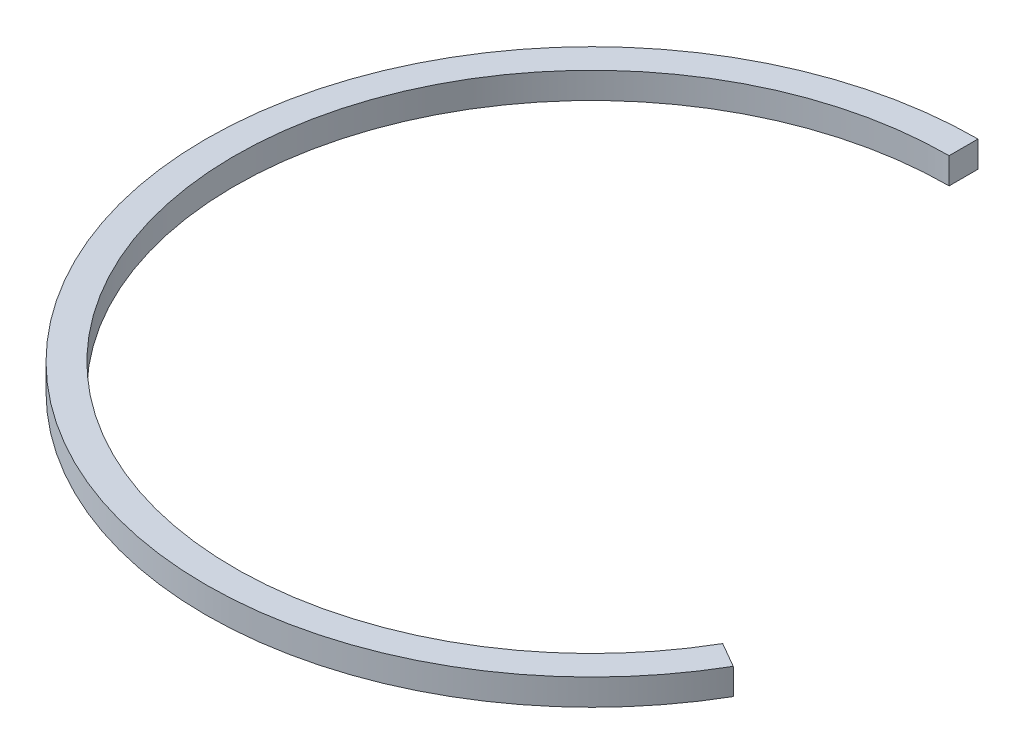
ISO-10303-21;
HEADER;
FILE_DESCRIPTION(('STEP AP214'),'2;1');
FILE_NAME('part.step','',(''),(''),'','','');
FILE_SCHEMA(('AUTOMOTIVE_DESIGN { 1 0 10303 214 1 1 1 1 }'));
ENDSEC;
DATA;
#1=APPLICATION_CONTEXT('core data for automotive mechanical design processes');
#2=APPLICATION_PROTOCOL_DEFINITION('international standard','automotive_design',2000,#1);
#3=PRODUCT_CONTEXT('',#1,'mechanical');
#4=PRODUCT('Part','Part','',(#3));
#5=PRODUCT_RELATED_PRODUCT_CATEGORY('part','',(#4));
#6=PRODUCT_DEFINITION_FORMATION('','',#4);
#7=PRODUCT_DEFINITION_CONTEXT('part definition',#1,'design');
#8=PRODUCT_DEFINITION('design','',#6,#7);
#9=PRODUCT_DEFINITION_SHAPE('','',#8);
#10=(LENGTH_UNIT() NAMED_UNIT(*) SI_UNIT(.MILLI.,.METRE.));
#11=(NAMED_UNIT(*) PLANE_ANGLE_UNIT() SI_UNIT($,.RADIAN.));
#12=(NAMED_UNIT(*) SI_UNIT($,.STERADIAN.) SOLID_ANGLE_UNIT());
#13=UNCERTAINTY_MEASURE_WITH_UNIT(LENGTH_MEASURE(1.E-05),#10,'distance_accuracy_value','');
#14=(GEOMETRIC_REPRESENTATION_CONTEXT(3) GLOBAL_UNCERTAINTY_ASSIGNED_CONTEXT((#13)) GLOBAL_UNIT_ASSIGNED_CONTEXT((#10,
#11,#12)) REPRESENTATION_CONTEXT('',''));
#15=CARTESIAN_POINT('',(0.,0.,0.));
#16=DIRECTION('',(0.,0.,1.));
#17=DIRECTION('',(1.,0.,0.));
#18=AXIS2_PLACEMENT_3D('',#15,#16,#17);
#19=CARTESIAN_POINT('',(0.,3.175,0.));
#20=DIRECTION('',(0.,-1.,0.));
#21=DIRECTION('',(0.,0.,-1.));
#22=AXIS2_PLACEMENT_3D('',#19,#20,#21);
#23=CYLINDRICAL_SURFACE('',#22,43.3);
#24=CARTESIAN_POINT('',(0.,0.,0.));
#25=DIRECTION('',(0.,-1.,0.));
#26=DIRECTION('',(0.,0.,1.));
#27=AXIS2_PLACEMENT_3D('',#24,#25,#26);
#28=CIRCLE('',#27,43.3);
#29=CARTESIAN_POINT('',(37.4988999838661,0.,21.6500000000002));
#30=VERTEX_POINT('',#29);
#31=CARTESIAN_POINT('',(0.,0.,-43.3));
#32=VERTEX_POINT('',#31);
#33=EDGE_CURVE('E96',#30,#32,#28,.T.);
#34=ORIENTED_EDGE('',*,*,#33,.T.);
#35=DIRECTION('',(0.,-1.,0.));
#36=VECTOR('',#35,1.);
#37=CARTESIAN_POINT('',(0.,3.175,-43.3));
#38=LINE('',#37,#36);
#39=CARTESIAN_POINT('',(0.,3.175,-43.3));
#40=VERTEX_POINT('',#39);
#41=EDGE_CURVE('E11',#40,#32,#38,.T.);
#42=ORIENTED_EDGE('',*,*,#41,.F.);
#43=CARTESIAN_POINT('',(0.,3.175,0.));
#44=DIRECTION('',(0.,-1.,0.));
#45=DIRECTION('',(0.,0.,1.));
#46=AXIS2_PLACEMENT_3D('',#43,#44,#45);
#47=CIRCLE('',#46,43.3);
#48=CARTESIAN_POINT('',(37.4988999838661,3.175,21.6500000000002));
#49=VERTEX_POINT('',#48);
#50=EDGE_CURVE('E84',#49,#40,#47,.T.);
#51=ORIENTED_EDGE('',*,*,#50,.F.);
#52=DIRECTION('',(0.,-1.,0.));
#53=VECTOR('',#52,1.);
#54=CARTESIAN_POINT('',(37.4988999838661,3.175,21.6500000000002));
#55=LINE('',#54,#53);
#56=EDGE_CURVE('E92',#49,#30,#55,.T.);
#57=ORIENTED_EDGE('',*,*,#56,.T.);
#58=EDGE_LOOP('',(#34,#42,#51,#57));
#59=FACE_BOUND('',#58,.T.);
#60=ADVANCED_FACE('F33',(#59),#23,.F.);
#61=CARTESIAN_POINT('',(0.,3.175,-43.3));
#62=DIRECTION('',(-1.,0.,0.));
#63=DIRECTION('',(0.,0.,1.));
#64=AXIS2_PLACEMENT_3D('',#61,#62,#63);
#65=PLANE('',#64);
#66=DIRECTION('',(0.,0.,-1.));
#67=VECTOR('',#66,1.);
#68=CARTESIAN_POINT('',(0.,0.,-43.3));
#69=LINE('',#68,#67);
#70=CARTESIAN_POINT('',(0.,0.,-46.8));
#71=VERTEX_POINT('',#70);
#72=EDGE_CURVE('E88',#32,#71,#69,.T.);
#73=ORIENTED_EDGE('',*,*,#72,.T.);
#74=DIRECTION('',(0.,-1.,0.));
#75=VECTOR('',#74,1.);
#76=CARTESIAN_POINT('',(0.,3.175,-46.8));
#77=LINE('',#76,#75);
#78=CARTESIAN_POINT('',(0.,3.175,-46.8));
#79=VERTEX_POINT('',#78);
#80=EDGE_CURVE('E41',#79,#71,#77,.T.);
#81=ORIENTED_EDGE('',*,*,#80,.F.);
#82=DIRECTION('',(0.,0.,-1.));
#83=VECTOR('',#82,1.);
#84=CARTESIAN_POINT('',(0.,3.175,-43.3));
#85=LINE('',#84,#83);
#86=EDGE_CURVE('E79',#40,#79,#85,.T.);
#87=ORIENTED_EDGE('',*,*,#86,.F.);
#88=ORIENTED_EDGE('',*,*,#41,.T.);
#89=EDGE_LOOP('',(#73,#81,#87,#88));
#90=FACE_BOUND('',#89,.T.);
#91=ADVANCED_FACE('F87',(#90),#65,.F.);
#92=CARTESIAN_POINT('',(0.,3.175,0.));
#93=DIRECTION('',(0.,-1.,0.));
#94=DIRECTION('',(0.,0.,-1.));
#95=AXIS2_PLACEMENT_3D('',#92,#93,#94);
#96=CYLINDRICAL_SURFACE('',#95,46.8);
#97=CARTESIAN_POINT('',(0.,0.,0.));
#98=DIRECTION('',(0.,1.,0.));
#99=DIRECTION('',(0.,0.,1.));
#100=AXIS2_PLACEMENT_3D('',#97,#98,#99);
#101=CIRCLE('',#100,46.8);
#102=CARTESIAN_POINT('',(40.5299888971116,0.,23.4000000000002));
#103=VERTEX_POINT('',#102);
#104=EDGE_CURVE('E66',#71,#103,#101,.T.);
#105=ORIENTED_EDGE('',*,*,#104,.T.);
#106=DIRECTION('',(0.,-1.,0.));
#107=VECTOR('',#106,1.);
#108=CARTESIAN_POINT('',(40.5299888971116,3.175,23.4000000000002));
#109=LINE('',#108,#107);
#110=CARTESIAN_POINT('',(40.5299888971116,3.175,23.4000000000002));
#111=VERTEX_POINT('',#110);
#112=EDGE_CURVE('E89',#111,#103,#109,.T.);
#113=ORIENTED_EDGE('',*,*,#112,.F.);
#114=CARTESIAN_POINT('',(0.,3.175,0.));
#115=DIRECTION('',(0.,1.,0.));
#116=DIRECTION('',(0.,0.,1.));
#117=AXIS2_PLACEMENT_3D('',#114,#115,#116);
#118=CIRCLE('',#117,46.8);
#119=EDGE_CURVE('E82',#79,#111,#118,.T.);
#120=ORIENTED_EDGE('',*,*,#119,.F.);
#121=ORIENTED_EDGE('',*,*,#80,.T.);
#122=EDGE_LOOP('',(#105,#113,#120,#121));
#123=FACE_BOUND('',#122,.T.);
#124=ADVANCED_FACE('F90',(#123),#96,.T.);
#125=CARTESIAN_POINT('',(37.4988999838661,3.175,21.6500000000002));
#126=DIRECTION('',(-0.500000000000004,0.,0.866025403784436));
#127=DIRECTION('',(0.866025403784436,0.,0.500000000000004));
#128=AXIS2_PLACEMENT_3D('',#125,#126,#127);
#129=PLANE('',#128);
#130=DIRECTION('',(-0.866025403784436,0.,-0.500000000000004));
#131=VECTOR('',#130,1.);
#132=CARTESIAN_POINT('',(37.4988999838661,0.,21.6500000000002));
#133=LINE('',#132,#131);
#134=EDGE_CURVE('E72',#103,#30,#133,.T.);
#135=ORIENTED_EDGE('',*,*,#134,.T.);
#136=ORIENTED_EDGE('',*,*,#56,.F.);
#137=DIRECTION('',(-0.866025403784436,0.,-0.500000000000004));
#138=VECTOR('',#137,1.);
#139=CARTESIAN_POINT('',(37.4988999838661,3.175,21.6500000000002));
#140=LINE('',#139,#138);
#141=EDGE_CURVE('E49',#111,#49,#140,.T.);
#142=ORIENTED_EDGE('',*,*,#141,.F.);
#143=ORIENTED_EDGE('',*,*,#112,.T.);
#144=EDGE_LOOP('',(#135,#136,#142,#143));
#145=FACE_BOUND('',#144,.T.);
#146=ADVANCED_FACE('F103',(#145),#129,.F.);
#147=CARTESIAN_POINT('',(0.,3.175,0.));
#148=DIRECTION('',(0.,1.,0.));
#149=DIRECTION('',(0.,0.,1.));
#150=AXIS2_PLACEMENT_3D('',#147,#148,#149);
#151=PLANE('',#150);
#152=ORIENTED_EDGE('',*,*,#50,.T.);
#153=ORIENTED_EDGE('',*,*,#86,.T.);
#154=ORIENTED_EDGE('',*,*,#119,.T.);
#155=ORIENTED_EDGE('',*,*,#141,.T.);
#156=EDGE_LOOP('',(#152,#153,#154,#155));
#157=FACE_BOUND('',#156,.T.);
#158=ADVANCED_FACE('F80',(#157),#151,.T.);
#159=CARTESIAN_POINT('',(0.,0.,0.));
#160=DIRECTION('',(0.,1.,0.));
#161=DIRECTION('',(0.,0.,1.));
#162=AXIS2_PLACEMENT_3D('',#159,#160,#161);
#163=PLANE('',#162);
#164=ORIENTED_EDGE('',*,*,#33,.F.);
#165=ORIENTED_EDGE('',*,*,#134,.F.);
#166=ORIENTED_EDGE('',*,*,#104,.F.);
#167=ORIENTED_EDGE('',*,*,#72,.F.);
#168=EDGE_LOOP('',(#164,#165,#166,#167));
#169=FACE_BOUND('',#168,.T.);
#170=ADVANCED_FACE('F106',(#169),#163,.F.);
#171=CLOSED_SHELL('',(#60,#91,#124,#146,#158,#170));
#172=MANIFOLD_SOLID_BREP('B2',#171);
#173=ADVANCED_BREP_SHAPE_REPRESENTATION('',(#18,#172),#14);
#174=SHAPE_DEFINITION_REPRESENTATION(#9,#173);
ENDSEC;
END-ISO-10303-21;
